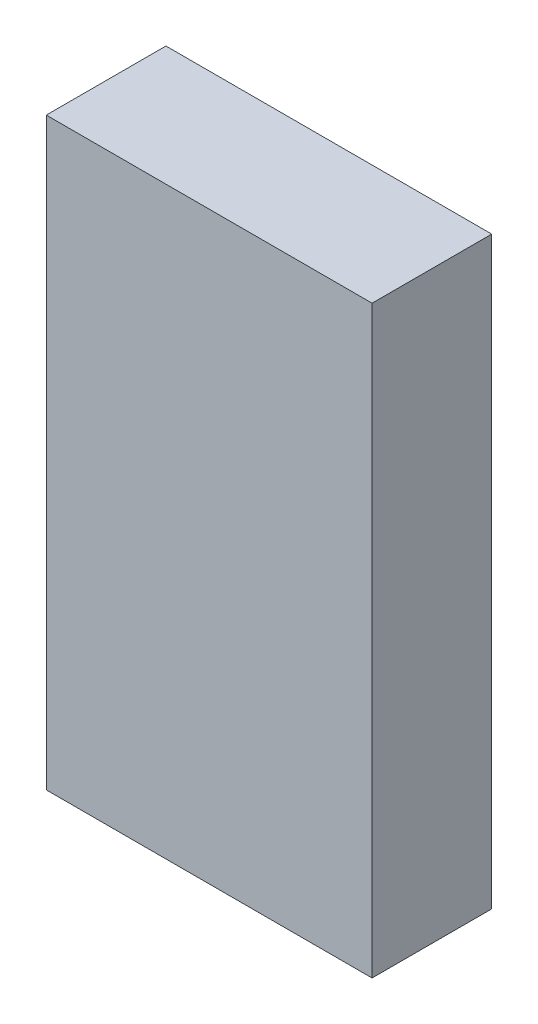
ISO-10303-21;
HEADER;
FILE_DESCRIPTION(('STEP AP214'),'2;1');
FILE_NAME('part.step','',(''),(''),'','','');
FILE_SCHEMA(('AUTOMOTIVE_DESIGN { 1 0 10303 214 1 1 1 1 }'));
ENDSEC;
DATA;
#1=APPLICATION_CONTEXT('core data for automotive mechanical design processes');
#2=APPLICATION_PROTOCOL_DEFINITION('international standard','automotive_design',2000,#1);
#3=PRODUCT_CONTEXT('',#1,'mechanical');
#4=PRODUCT('Part','Part','',(#3));
#5=PRODUCT_RELATED_PRODUCT_CATEGORY('part','',(#4));
#6=PRODUCT_DEFINITION_FORMATION('','',#4);
#7=PRODUCT_DEFINITION_CONTEXT('part definition',#1,'design');
#8=PRODUCT_DEFINITION('design','',#6,#7);
#9=PRODUCT_DEFINITION_SHAPE('','',#8);
#10=(LENGTH_UNIT() NAMED_UNIT(*) SI_UNIT(.MILLI.,.METRE.));
#11=(NAMED_UNIT(*) PLANE_ANGLE_UNIT() SI_UNIT($,.RADIAN.));
#12=(NAMED_UNIT(*) SI_UNIT($,.STERADIAN.) SOLID_ANGLE_UNIT());
#13=UNCERTAINTY_MEASURE_WITH_UNIT(LENGTH_MEASURE(1.E-05),#10,'distance_accuracy_value','');
#14=(GEOMETRIC_REPRESENTATION_CONTEXT(3) GLOBAL_UNCERTAINTY_ASSIGNED_CONTEXT((#13)) GLOBAL_UNIT_ASSIGNED_CONTEXT((#10,
#11,#12)) REPRESENTATION_CONTEXT('',''));
#15=CARTESIAN_POINT('',(0.,0.,0.));
#16=DIRECTION('',(0.,0.,1.));
#17=DIRECTION('',(1.,0.,0.));
#18=AXIS2_PLACEMENT_3D('',#15,#16,#17);
#19=CARTESIAN_POINT('',(13.6142635035412,24.4220790847862,10.));
#20=DIRECTION('',(-1.,0.,0.));
#21=DIRECTION('',(0.,0.,1.));
#22=AXIS2_PLACEMENT_3D('',#19,#20,#21);
#23=PLANE('',#22);
#24=DIRECTION('',(0.,1.,0.));
#25=VECTOR('',#24,1.);
#26=CARTESIAN_POINT('',(13.6142635035412,24.4220790847862,0.));
#27=LINE('',#26,#25);
#28=CARTESIAN_POINT('',(13.6142635035412,-24.4220790847862,0.));
#29=VERTEX_POINT('',#28);
#30=CARTESIAN_POINT('',(13.6142635035412,24.4220790847862,0.));
#31=VERTEX_POINT('',#30);
#32=EDGE_CURVE('E98',#29,#31,#27,.T.);
#33=ORIENTED_EDGE('',*,*,#32,.T.);
#34=DIRECTION('',(0.,0.,-1.));
#35=VECTOR('',#34,1.);
#36=CARTESIAN_POINT('',(13.6142635035412,24.4220790847862,10.));
#37=LINE('',#36,#35);
#38=CARTESIAN_POINT('',(13.6142635035412,24.4220790847862,10.));
#39=VERTEX_POINT('',#38);
#40=EDGE_CURVE('E11',#39,#31,#37,.T.);
#41=ORIENTED_EDGE('',*,*,#40,.F.);
#42=DIRECTION('',(0.,1.,0.));
#43=VECTOR('',#42,1.);
#44=CARTESIAN_POINT('',(13.6142635035412,24.4220790847862,10.));
#45=LINE('',#44,#43);
#46=CARTESIAN_POINT('',(13.6142635035412,-24.4220790847862,10.));
#47=VERTEX_POINT('',#46);
#48=EDGE_CURVE('E86',#47,#39,#45,.T.);
#49=ORIENTED_EDGE('',*,*,#48,.F.);
#50=DIRECTION('',(0.,0.,-1.));
#51=VECTOR('',#50,1.);
#52=CARTESIAN_POINT('',(13.6142635035412,-24.4220790847862,10.));
#53=LINE('',#52,#51);
#54=EDGE_CURVE('E94',#47,#29,#53,.T.);
#55=ORIENTED_EDGE('',*,*,#54,.T.);
#56=EDGE_LOOP('',(#33,#41,#49,#55));
#57=FACE_BOUND('',#56,.T.);
#58=ADVANCED_FACE('F35',(#57),#23,.F.);
#59=CARTESIAN_POINT('',(-13.6142635035412,24.4220790847862,10.));
#60=DIRECTION('',(0.,-1.,0.));
#61=DIRECTION('',(0.,0.,-1.));
#62=AXIS2_PLACEMENT_3D('',#59,#60,#61);
#63=PLANE('',#62);
#64=DIRECTION('',(-1.,0.,0.));
#65=VECTOR('',#64,1.);
#66=CARTESIAN_POINT('',(-13.6142635035412,24.4220790847862,0.));
#67=LINE('',#66,#65);
#68=CARTESIAN_POINT('',(-13.6142635035412,24.4220790847862,0.));
#69=VERTEX_POINT('',#68);
#70=EDGE_CURVE('E90',#31,#69,#67,.T.);
#71=ORIENTED_EDGE('',*,*,#70,.T.);
#72=DIRECTION('',(0.,0.,-1.));
#73=VECTOR('',#72,1.);
#74=CARTESIAN_POINT('',(-13.6142635035412,24.4220790847862,10.));
#75=LINE('',#74,#73);
#76=CARTESIAN_POINT('',(-13.6142635035412,24.4220790847862,10.));
#77=VERTEX_POINT('',#76);
#78=EDGE_CURVE('E43',#77,#69,#75,.T.);
#79=ORIENTED_EDGE('',*,*,#78,.F.);
#80=DIRECTION('',(-1.,0.,0.));
#81=VECTOR('',#80,1.);
#82=CARTESIAN_POINT('',(-13.6142635035412,24.4220790847862,10.));
#83=LINE('',#82,#81);
#84=EDGE_CURVE('E81',#39,#77,#83,.T.);
#85=ORIENTED_EDGE('',*,*,#84,.F.);
#86=ORIENTED_EDGE('',*,*,#40,.T.);
#87=EDGE_LOOP('',(#71,#79,#85,#86));
#88=FACE_BOUND('',#87,.T.);
#89=ADVANCED_FACE('F89',(#88),#63,.F.);
#90=CARTESIAN_POINT('',(-13.6142635035412,24.4220790847862,10.));
#91=DIRECTION('',(1.,0.,0.));
#92=DIRECTION('',(0.,0.,-1.));
#93=AXIS2_PLACEMENT_3D('',#90,#91,#92);
#94=PLANE('',#93);
#95=DIRECTION('',(0.,-1.,0.));
#96=VECTOR('',#95,1.);
#97=CARTESIAN_POINT('',(-13.6142635035412,24.4220790847862,0.));
#98=LINE('',#97,#96);
#99=CARTESIAN_POINT('',(-13.6142635035412,-24.4220790847862,0.));
#100=VERTEX_POINT('',#99);
#101=EDGE_CURVE('E68',#69,#100,#98,.T.);
#102=ORIENTED_EDGE('',*,*,#101,.T.);
#103=DIRECTION('',(0.,0.,-1.));
#104=VECTOR('',#103,1.);
#105=CARTESIAN_POINT('',(-13.6142635035412,-24.4220790847862,10.));
#106=LINE('',#105,#104);
#107=CARTESIAN_POINT('',(-13.6142635035412,-24.4220790847862,10.));
#108=VERTEX_POINT('',#107);
#109=EDGE_CURVE('E91',#108,#100,#106,.T.);
#110=ORIENTED_EDGE('',*,*,#109,.F.);
#111=DIRECTION('',(0.,-1.,0.));
#112=VECTOR('',#111,1.);
#113=CARTESIAN_POINT('',(-13.6142635035412,24.4220790847862,10.));
#114=LINE('',#113,#112);
#115=EDGE_CURVE('E84',#77,#108,#114,.T.);
#116=ORIENTED_EDGE('',*,*,#115,.F.);
#117=ORIENTED_EDGE('',*,*,#78,.T.);
#118=EDGE_LOOP('',(#102,#110,#116,#117));
#119=FACE_BOUND('',#118,.T.);
#120=ADVANCED_FACE('F92',(#119),#94,.F.);
#121=CARTESIAN_POINT('',(-13.6142635035412,-24.4220790847862,10.));
#122=DIRECTION('',(0.,1.,0.));
#123=DIRECTION('',(0.,0.,1.));
#124=AXIS2_PLACEMENT_3D('',#121,#122,#123);
#125=PLANE('',#124);
#126=DIRECTION('',(1.,0.,0.));
#127=VECTOR('',#126,1.);
#128=CARTESIAN_POINT('',(-13.6142635035412,-24.4220790847862,0.));
#129=LINE('',#128,#127);
#130=EDGE_CURVE('E74',#100,#29,#129,.T.);
#131=ORIENTED_EDGE('',*,*,#130,.T.);
#132=ORIENTED_EDGE('',*,*,#54,.F.);
#133=DIRECTION('',(1.,0.,0.));
#134=VECTOR('',#133,1.);
#135=CARTESIAN_POINT('',(-13.6142635035412,-24.4220790847862,10.));
#136=LINE('',#135,#134);
#137=EDGE_CURVE('E51',#108,#47,#136,.T.);
#138=ORIENTED_EDGE('',*,*,#137,.F.);
#139=ORIENTED_EDGE('',*,*,#109,.T.);
#140=EDGE_LOOP('',(#131,#132,#138,#139));
#141=FACE_BOUND('',#140,.T.);
#142=ADVANCED_FACE('F105',(#141),#125,.F.);
#143=CARTESIAN_POINT('',(0.,0.,10.));
#144=DIRECTION('',(0.,0.,1.));
#145=DIRECTION('',(1.,0.,0.));
#146=AXIS2_PLACEMENT_3D('',#143,#144,#145);
#147=PLANE('',#146);
#148=ORIENTED_EDGE('',*,*,#48,.T.);
#149=ORIENTED_EDGE('',*,*,#84,.T.);
#150=ORIENTED_EDGE('',*,*,#115,.T.);
#151=ORIENTED_EDGE('',*,*,#137,.T.);
#152=EDGE_LOOP('',(#148,#149,#150,#151));
#153=FACE_BOUND('',#152,.T.);
#154=ADVANCED_FACE('F82',(#153),#147,.T.);
#155=CARTESIAN_POINT('',(0.,0.,0.));
#156=DIRECTION('',(0.,0.,1.));
#157=DIRECTION('',(1.,0.,0.));
#158=AXIS2_PLACEMENT_3D('',#155,#156,#157);
#159=PLANE('',#158);
#160=ORIENTED_EDGE('',*,*,#32,.F.);
#161=ORIENTED_EDGE('',*,*,#130,.F.);
#162=ORIENTED_EDGE('',*,*,#101,.F.);
#163=ORIENTED_EDGE('',*,*,#70,.F.);
#164=EDGE_LOOP('',(#160,#161,#162,#163));
#165=FACE_BOUND('',#164,.T.);
#166=ADVANCED_FACE('F108',(#165),#159,.F.);
#167=CLOSED_SHELL('',(#58,#89,#120,#142,#154,#166));
#168=MANIFOLD_SOLID_BREP('B2',#167);
#169=ADVANCED_BREP_SHAPE_REPRESENTATION('',(#18,#168),#14);
#170=SHAPE_DEFINITION_REPRESENTATION(#9,#169);
ENDSEC;
END-ISO-10303-21;
